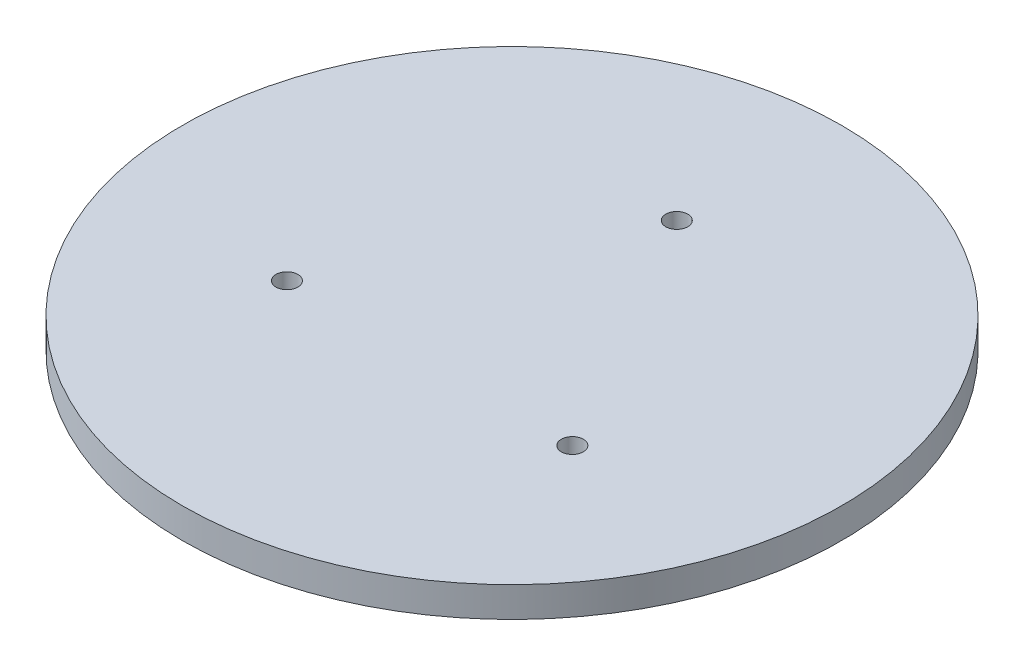
ISO-10303-21;
HEADER;
FILE_DESCRIPTION(('STEP AP214'),'2;1');
FILE_NAME('part.step','',(''),(''),'','','');
FILE_SCHEMA(('AUTOMOTIVE_DESIGN { 1 0 10303 214 1 1 1 1 }'));
ENDSEC;
DATA;
#1=APPLICATION_CONTEXT('core data for automotive mechanical design processes');
#2=APPLICATION_PROTOCOL_DEFINITION('international standard','automotive_design',2000,#1);
#3=PRODUCT_CONTEXT('',#1,'mechanical');
#4=PRODUCT('Part','Part','',(#3));
#5=PRODUCT_RELATED_PRODUCT_CATEGORY('part','',(#4));
#6=PRODUCT_DEFINITION_FORMATION('','',#4);
#7=PRODUCT_DEFINITION_CONTEXT('part definition',#1,'design');
#8=PRODUCT_DEFINITION('design','',#6,#7);
#9=PRODUCT_DEFINITION_SHAPE('','',#8);
#10=(LENGTH_UNIT() NAMED_UNIT(*) SI_UNIT(.MILLI.,.METRE.));
#11=(NAMED_UNIT(*) PLANE_ANGLE_UNIT() SI_UNIT($,.RADIAN.));
#12=(NAMED_UNIT(*) SI_UNIT($,.STERADIAN.) SOLID_ANGLE_UNIT());
#13=UNCERTAINTY_MEASURE_WITH_UNIT(LENGTH_MEASURE(1.E-05),#10,'distance_accuracy_value','');
#14=(GEOMETRIC_REPRESENTATION_CONTEXT(3) GLOBAL_UNCERTAINTY_ASSIGNED_CONTEXT((#13)) GLOBAL_UNIT_ASSIGNED_CONTEXT((#10,
#11,#12)) REPRESENTATION_CONTEXT('',''));
#15=CARTESIAN_POINT('',(0.,0.,0.));
#16=DIRECTION('',(0.,0.,1.));
#17=DIRECTION('',(1.,0.,0.));
#18=AXIS2_PLACEMENT_3D('',#15,#16,#17);
#19=CARTESIAN_POINT('',(0.,6.35,0.));
#20=DIRECTION('',(0.,1.,0.));
#21=DIRECTION('',(0.,0.,1.));
#22=AXIS2_PLACEMENT_3D('',#19,#20,#21);
#23=PLANE('',#22);
#24=CARTESIAN_POINT('',(30.0259667746103,6.35,17.3355));
#25=DIRECTION('',(0.,1.,0.));
#26=DIRECTION('',(0.,0.,1.));
#27=AXIS2_PLACEMENT_3D('',#24,#25,#26);
#28=CIRCLE('',#27,2.3114);
#29=CARTESIAN_POINT('',(30.0259667746103,6.35,19.6469));
#30=VERTEX_POINT('',#29);
#31=EDGE_CURVE('E47',#30,#30,#28,.T.);
#32=ORIENTED_EDGE('',*,*,#31,.F.);
#33=EDGE_LOOP('',(#32));
#34=FACE_BOUND('',#33,.T.);
#35=CARTESIAN_POINT('',(0.,6.35,0.));
#36=DIRECTION('',(0.,1.,0.));
#37=DIRECTION('',(0.,0.,1.));
#38=AXIS2_PLACEMENT_3D('',#35,#36,#37);
#39=CIRCLE('',#38,69.342);
#40=CARTESIAN_POINT('',(0.,6.35,69.342));
#41=VERTEX_POINT('',#40);
#42=EDGE_CURVE('E10',#41,#41,#39,.T.);
#43=ORIENTED_EDGE('',*,*,#42,.T.);
#44=EDGE_LOOP('',(#43));
#45=FACE_BOUND('',#44,.T.);
#46=CARTESIAN_POINT('',(0.,6.35,-34.671));
#47=DIRECTION('',(0.,1.,0.));
#48=DIRECTION('',(0.,0.,1.));
#49=AXIS2_PLACEMENT_3D('',#46,#47,#48);
#50=CIRCLE('',#49,2.3114);
#51=CARTESIAN_POINT('',(0.,6.35,-32.3596));
#52=VERTEX_POINT('',#51);
#53=EDGE_CURVE('E42',#52,#52,#50,.T.);
#54=ORIENTED_EDGE('',*,*,#53,.F.);
#55=EDGE_LOOP('',(#54));
#56=FACE_BOUND('',#55,.T.);
#57=CARTESIAN_POINT('',(-30.0259667746103,6.35,17.3355));
#58=DIRECTION('',(0.,1.,0.));
#59=DIRECTION('',(0.,0.,1.));
#60=AXIS2_PLACEMENT_3D('',#57,#58,#59);
#61=CIRCLE('',#60,2.3114);
#62=CARTESIAN_POINT('',(-30.0259667746103,6.35,19.6469));
#63=VERTEX_POINT('',#62);
#64=EDGE_CURVE('E53',#63,#63,#61,.T.);
#65=ORIENTED_EDGE('',*,*,#64,.F.);
#66=EDGE_LOOP('',(#65));
#67=FACE_BOUND('',#66,.T.);
#68=ADVANCED_FACE('F31',(#34,#45,#56,#67),#23,.T.);
#69=CARTESIAN_POINT('',(0.,0.,0.));
#70=DIRECTION('',(0.,1.,0.));
#71=DIRECTION('',(0.,0.,1.));
#72=AXIS2_PLACEMENT_3D('',#69,#70,#71);
#73=PLANE('',#72);
#74=CARTESIAN_POINT('',(30.0259667746103,0.,17.3355));
#75=DIRECTION('',(0.,1.,0.));
#76=DIRECTION('',(0.,0.,1.));
#77=AXIS2_PLACEMENT_3D('',#74,#75,#76);
#78=CIRCLE('',#77,2.3114);
#79=CARTESIAN_POINT('',(30.0259667746103,0.,19.6469));
#80=VERTEX_POINT('',#79);
#81=EDGE_CURVE('E50',#80,#80,#78,.T.);
#82=ORIENTED_EDGE('',*,*,#81,.T.);
#83=EDGE_LOOP('',(#82));
#84=FACE_BOUND('',#83,.T.);
#85=CARTESIAN_POINT('',(0.,0.,0.));
#86=DIRECTION('',(0.,1.,0.));
#87=DIRECTION('',(0.,0.,1.));
#88=AXIS2_PLACEMENT_3D('',#85,#86,#87);
#89=CIRCLE('',#88,69.342);
#90=CARTESIAN_POINT('',(0.,0.,69.342));
#91=VERTEX_POINT('',#90);
#92=EDGE_CURVE('E35',#91,#91,#89,.T.);
#93=ORIENTED_EDGE('',*,*,#92,.F.);
#94=EDGE_LOOP('',(#93));
#95=FACE_BOUND('',#94,.T.);
#96=CARTESIAN_POINT('',(0.,0.,-34.671));
#97=DIRECTION('',(0.,1.,0.));
#98=DIRECTION('',(0.,0.,1.));
#99=AXIS2_PLACEMENT_3D('',#96,#97,#98);
#100=CIRCLE('',#99,2.3114);
#101=CARTESIAN_POINT('',(0.,0.,-32.3596));
#102=VERTEX_POINT('',#101);
#103=EDGE_CURVE('E44',#102,#102,#100,.T.);
#104=ORIENTED_EDGE('',*,*,#103,.T.);
#105=EDGE_LOOP('',(#104));
#106=FACE_BOUND('',#105,.T.);
#107=CARTESIAN_POINT('',(-30.0259667746103,0.,17.3355));
#108=DIRECTION('',(0.,1.,0.));
#109=DIRECTION('',(0.,0.,1.));
#110=AXIS2_PLACEMENT_3D('',#107,#108,#109);
#111=CIRCLE('',#110,2.3114);
#112=CARTESIAN_POINT('',(-30.0259667746103,0.,19.6469));
#113=VERTEX_POINT('',#112);
#114=EDGE_CURVE('E56',#113,#113,#111,.T.);
#115=ORIENTED_EDGE('',*,*,#114,.T.);
#116=EDGE_LOOP('',(#115));
#117=FACE_BOUND('',#116,.T.);
#118=ADVANCED_FACE('F66',(#84,#95,#106,#117),#73,.F.);
#119=CARTESIAN_POINT('',(0.,6.35,0.));
#120=DIRECTION('',(0.,-1.,0.));
#121=DIRECTION('',(0.,0.,-1.));
#122=AXIS2_PLACEMENT_3D('',#119,#120,#121);
#123=CYLINDRICAL_SURFACE('',#122,69.342);
#124=ORIENTED_EDGE('',*,*,#42,.F.);
#125=EDGE_LOOP('',(#124));
#126=FACE_BOUND('',#125,.T.);
#127=ORIENTED_EDGE('',*,*,#92,.T.);
#128=EDGE_LOOP('',(#127));
#129=FACE_BOUND('',#128,.T.);
#130=ADVANCED_FACE('F33',(#126,#129),#123,.T.);
#131=CARTESIAN_POINT('',(0.,6.35,-34.671));
#132=DIRECTION('',(0.,-1.,0.));
#133=DIRECTION('',(0.,0.,-1.));
#134=AXIS2_PLACEMENT_3D('',#131,#132,#133);
#135=CYLINDRICAL_SURFACE('',#134,2.3114);
#136=ORIENTED_EDGE('',*,*,#53,.T.);
#137=EDGE_LOOP('',(#136));
#138=FACE_BOUND('',#137,.T.);
#139=ORIENTED_EDGE('',*,*,#103,.F.);
#140=EDGE_LOOP('',(#139));
#141=FACE_BOUND('',#140,.T.);
#142=ADVANCED_FACE('F75',(#138,#141),#135,.F.);
#143=CARTESIAN_POINT('',(30.0259667746103,6.35,17.3355));
#144=DIRECTION('',(0.,-1.,0.));
#145=DIRECTION('',(0.,0.,-1.));
#146=AXIS2_PLACEMENT_3D('',#143,#144,#145);
#147=CYLINDRICAL_SURFACE('',#146,2.3114);
#148=ORIENTED_EDGE('',*,*,#31,.T.);
#149=EDGE_LOOP('',(#148));
#150=FACE_BOUND('',#149,.T.);
#151=ORIENTED_EDGE('',*,*,#81,.F.);
#152=EDGE_LOOP('',(#151));
#153=FACE_BOUND('',#152,.T.);
#154=ADVANCED_FACE('F78',(#150,#153),#147,.F.);
#155=CARTESIAN_POINT('',(-30.0259667746103,6.35,17.3355));
#156=DIRECTION('',(0.,-1.,0.));
#157=DIRECTION('',(0.,0.,-1.));
#158=AXIS2_PLACEMENT_3D('',#155,#156,#157);
#159=CYLINDRICAL_SURFACE('',#158,2.3114);
#160=ORIENTED_EDGE('',*,*,#64,.T.);
#161=EDGE_LOOP('',(#160));
#162=FACE_BOUND('',#161,.T.);
#163=ORIENTED_EDGE('',*,*,#114,.F.);
#164=EDGE_LOOP('',(#163));
#165=FACE_BOUND('',#164,.T.);
#166=ADVANCED_FACE('F62',(#162,#165),#159,.F.);
#167=CLOSED_SHELL('',(#68,#118,#130,#142,#154,#166));
#168=MANIFOLD_SOLID_BREP('B2',#167);
#169=ADVANCED_BREP_SHAPE_REPRESENTATION('',(#18,#168),#14);
#170=SHAPE_DEFINITION_REPRESENTATION(#9,#169);
ENDSEC;
END-ISO-10303-21;
